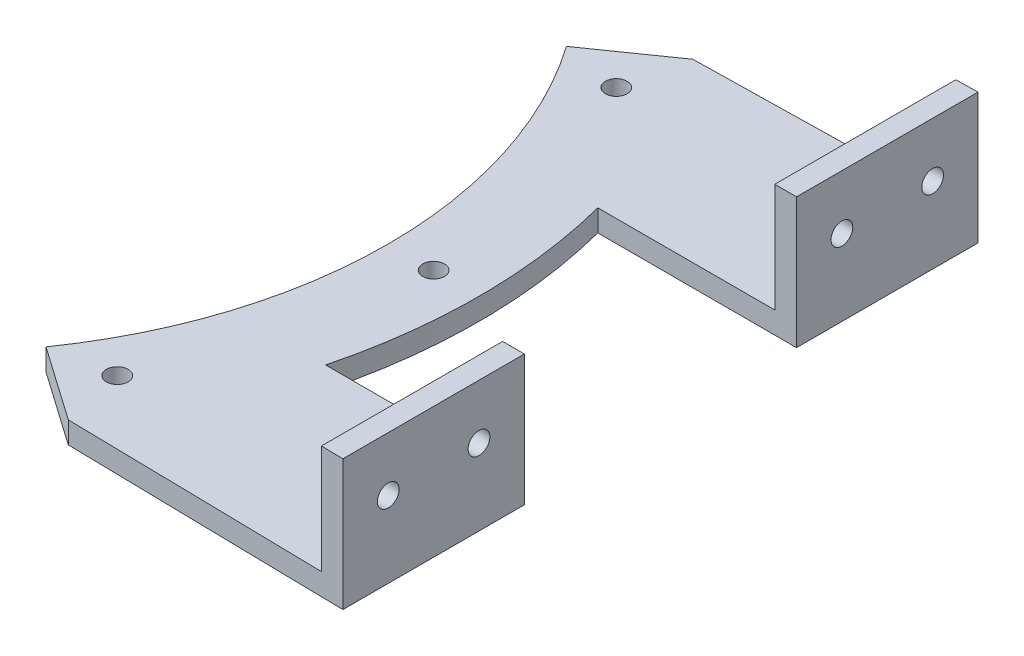
ISO-10303-21;
HEADER;
FILE_DESCRIPTION(('STEP AP214'),'2;1');
FILE_NAME('part.step','',(''),(''),'','','');
FILE_SCHEMA(('AUTOMOTIVE_DESIGN { 1 0 10303 214 1 1 1 1 }'));
ENDSEC;
DATA;
#1=APPLICATION_CONTEXT('core data for automotive mechanical design processes');
#2=APPLICATION_PROTOCOL_DEFINITION('international standard','automotive_design',2000,#1);
#3=PRODUCT_CONTEXT('',#1,'mechanical');
#4=PRODUCT('Part','Part','',(#3));
#5=PRODUCT_RELATED_PRODUCT_CATEGORY('part','',(#4));
#6=PRODUCT_DEFINITION_FORMATION('','',#4);
#7=PRODUCT_DEFINITION_CONTEXT('part definition',#1,'design');
#8=PRODUCT_DEFINITION('design','',#6,#7);
#9=PRODUCT_DEFINITION_SHAPE('','',#8);
#10=(LENGTH_UNIT() NAMED_UNIT(*) SI_UNIT(.MILLI.,.METRE.));
#11=(NAMED_UNIT(*) PLANE_ANGLE_UNIT() SI_UNIT($,.RADIAN.));
#12=(NAMED_UNIT(*) SI_UNIT($,.STERADIAN.) SOLID_ANGLE_UNIT());
#13=UNCERTAINTY_MEASURE_WITH_UNIT(LENGTH_MEASURE(1.E-05),#10,'distance_accuracy_value','');
#14=(GEOMETRIC_REPRESENTATION_CONTEXT(3) GLOBAL_UNCERTAINTY_ASSIGNED_CONTEXT((#13)) GLOBAL_UNIT_ASSIGNED_CONTEXT((#10,
#11,#12)) REPRESENTATION_CONTEXT('',''));
#15=CARTESIAN_POINT('',(0.,0.,0.));
#16=DIRECTION('',(0.,0.,1.));
#17=DIRECTION('',(1.,0.,0.));
#18=AXIS2_PLACEMENT_3D('',#15,#16,#17);
#19=CARTESIAN_POINT('',(0.,12.,0.));
#20=DIRECTION('',(0.,1.,0.));
#21=DIRECTION('',(0.,0.,1.));
#22=AXIS2_PLACEMENT_3D('',#19,#20,#21);
#23=PLANE('',#22);
#24=CARTESIAN_POINT('',(275.,12.,0.));
#25=DIRECTION('',(0.,1.,0.));
#26=DIRECTION('',(0.,0.,1.));
#27=AXIS2_PLACEMENT_3D('',#24,#25,#26);
#28=CIRCLE('',#27,5.99999999999999);
#29=CARTESIAN_POINT('',(275.,12.,5.99999999999999));
#30=VERTEX_POINT('',#29);
#31=EDGE_CURVE('E195',#30,#30,#28,.T.);
#32=ORIENTED_EDGE('',*,*,#31,.F.);
#33=EDGE_LOOP('',(#32));
#34=FACE_BOUND('',#33,.T.);
#35=CARTESIAN_POINT('',(238.15698604072,12.,137.5));
#36=DIRECTION('',(0.,1.,0.));
#37=DIRECTION('',(0.,0.,1.));
#38=AXIS2_PLACEMENT_3D('',#35,#36,#37);
#39=CIRCLE('',#38,5.99999999999999);
#40=CARTESIAN_POINT('',(238.15698604072,12.,143.5));
#41=VERTEX_POINT('',#40);
#42=EDGE_CURVE('E201',#41,#41,#39,.T.);
#43=ORIENTED_EDGE('',*,*,#42,.F.);
#44=EDGE_LOOP('',(#43));
#45=FACE_BOUND('',#44,.T.);
#46=CARTESIAN_POINT('',(238.15698604072,12.,-137.5));
#47=DIRECTION('',(0.,1.,0.));
#48=DIRECTION('',(0.,0.,1.));
#49=AXIS2_PLACEMENT_3D('',#46,#47,#48);
#50=CIRCLE('',#49,5.99999999999999);
#51=CARTESIAN_POINT('',(238.15698604072,12.,-131.5));
#52=VERTEX_POINT('',#51);
#53=EDGE_CURVE('E189',#52,#52,#50,.T.);
#54=ORIENTED_EDGE('',*,*,#53,.F.);
#55=EDGE_LOOP('',(#54));
#56=FACE_BOUND('',#55,.T.);
#57=DIRECTION('',(1.,0.,0.));
#58=VECTOR('',#57,1.);
#59=CARTESIAN_POINT('',(400.,12.,-75.));
#60=LINE('',#59,#58);
#61=CARTESIAN_POINT('',(290.473750965556,12.,-75.));
#62=VERTEX_POINT('',#61);
#63=CARTESIAN_POINT('',(388.002159856452,12.,-75.));
#64=VERTEX_POINT('',#63);
#65=EDGE_CURVE('E50',#62,#64,#60,.T.);
#66=ORIENTED_EDGE('',*,*,#65,.T.);
#67=DIRECTION('',(0.,0.,1.));
#68=VECTOR('',#67,1.);
#69=CARTESIAN_POINT('',(388.002159856452,12.,-75.));
#70=LINE('',#69,#68);
#71=CARTESIAN_POINT('',(388.002159856452,12.,-174.772333819249));
#72=VERTEX_POINT('',#71);
#73=EDGE_CURVE('E156',#72,#64,#70,.T.);
#74=ORIENTED_EDGE('',*,*,#73,.F.);
#75=DIRECTION('',(-0.999820011962369,0.,0.0189721817292861));
#76=VECTOR('',#75,1.);
#77=CARTESIAN_POINT('',(245.745613286698,12.,-172.072930905313));
#78=LINE('',#77,#76);
#79=CARTESIAN_POINT('',(245.745613286698,12.,-172.072930905313));
#80=VERTEX_POINT('',#79);
#81=EDGE_CURVE('E207',#72,#80,#78,.T.);
#82=ORIENTED_EDGE('',*,*,#81,.T.);
#83=DIRECTION('',(-0.819152044288993,0.,0.573576436351044));
#84=VECTOR('',#83,1.);
#85=CARTESIAN_POINT('',(204.788011072248,12.,-143.394109087761));
#86=LINE('',#85,#84);
#87=CARTESIAN_POINT('',(204.788011072248,12.,-143.394109087761));
#88=VERTEX_POINT('',#87);
#89=EDGE_CURVE('E210',#80,#88,#86,.T.);
#90=ORIENTED_EDGE('',*,*,#89,.T.);
#91=CARTESIAN_POINT('',(0.,12.,0.));
#92=DIRECTION('',(0.,-1.,0.));
#93=DIRECTION('',(0.,0.,1.));
#94=AXIS2_PLACEMENT_3D('',#91,#92,#93);
#95=CIRCLE('',#94,250.);
#96=CARTESIAN_POINT('',(204.788011072248,12.,143.394109087761));
#97=VERTEX_POINT('',#96);
#98=EDGE_CURVE('E212',#88,#97,#95,.T.);
#99=ORIENTED_EDGE('',*,*,#98,.T.);
#100=DIRECTION('',(0.819152044288993,0.,0.573576436351044));
#101=VECTOR('',#100,1.);
#102=CARTESIAN_POINT('',(204.788011072248,12.,143.394109087761));
#103=LINE('',#102,#101);
#104=CARTESIAN_POINT('',(245.745613286698,12.,172.072930905313));
#105=VERTEX_POINT('',#104);
#106=EDGE_CURVE('E214',#97,#105,#103,.T.);
#107=ORIENTED_EDGE('',*,*,#106,.T.);
#108=DIRECTION('',(0.999820011962369,0.,0.0189721817292861));
#109=VECTOR('',#108,1.);
#110=CARTESIAN_POINT('',(245.745613286698,12.,172.072930905313));
#111=LINE('',#110,#109);
#112=CARTESIAN_POINT('',(388.002159856452,12.,174.772333819249));
#113=VERTEX_POINT('',#112);
#114=EDGE_CURVE('E216',#105,#113,#111,.T.);
#115=ORIENTED_EDGE('',*,*,#114,.T.);
#116=DIRECTION('',(0.,0.,1.));
#117=VECTOR('',#116,1.);
#118=CARTESIAN_POINT('',(388.002159856452,12.,75.));
#119=LINE('',#118,#117);
#120=CARTESIAN_POINT('',(388.002159856452,12.,75.));
#121=VERTEX_POINT('',#120);
#122=EDGE_CURVE('E57',#121,#113,#119,.T.);
#123=ORIENTED_EDGE('',*,*,#122,.F.);
#124=DIRECTION('',(-1.,0.,0.));
#125=VECTOR('',#124,1.);
#126=CARTESIAN_POINT('',(400.,12.,75.));
#127=LINE('',#126,#125);
#128=CARTESIAN_POINT('',(290.473750965556,12.,75.));
#129=VERTEX_POINT('',#128);
#130=EDGE_CURVE('E218',#121,#129,#127,.T.);
#131=ORIENTED_EDGE('',*,*,#130,.T.);
#132=CARTESIAN_POINT('',(0.,12.,0.));
#133=DIRECTION('',(0.,1.,0.));
#134=DIRECTION('',(0.,0.,1.));
#135=AXIS2_PLACEMENT_3D('',#132,#133,#134);
#136=CIRCLE('',#135,300.);
#137=EDGE_CURVE('E220',#129,#62,#136,.T.);
#138=ORIENTED_EDGE('',*,*,#137,.T.);
#139=EDGE_LOOP('',(#66,#74,#82,#90,#99,#107,#115,#123,#131,#138));
#140=FACE_BOUND('',#139,.T.);
#141=ADVANCED_FACE('F35',(#34,#45,#56,#140),#23,.T.);
#142=CARTESIAN_POINT('',(0.,0.,0.));
#143=DIRECTION('',(0.,1.,0.));
#144=DIRECTION('',(0.,0.,1.));
#145=AXIS2_PLACEMENT_3D('',#142,#143,#144);
#146=PLANE('',#145);
#147=DIRECTION('',(1.,0.,0.));
#148=VECTOR('',#147,1.);
#149=CARTESIAN_POINT('',(400.,0.,-75.));
#150=LINE('',#149,#148);
#151=CARTESIAN_POINT('',(290.473750965556,0.,-75.));
#152=VERTEX_POINT('',#151);
#153=CARTESIAN_POINT('',(400.,0.,-75.));
#154=VERTEX_POINT('',#153);
#155=EDGE_CURVE('E142',#152,#154,#150,.T.);
#156=ORIENTED_EDGE('',*,*,#155,.F.);
#157=CARTESIAN_POINT('',(0.,0.,0.));
#158=DIRECTION('',(0.,1.,0.));
#159=DIRECTION('',(0.,0.,1.));
#160=AXIS2_PLACEMENT_3D('',#157,#158,#159);
#161=CIRCLE('',#160,300.);
#162=CARTESIAN_POINT('',(290.473750965556,0.,75.));
#163=VERTEX_POINT('',#162);
#164=EDGE_CURVE('E208',#163,#152,#161,.T.);
#165=ORIENTED_EDGE('',*,*,#164,.F.);
#166=DIRECTION('',(-1.,0.,0.));
#167=VECTOR('',#166,1.);
#168=CARTESIAN_POINT('',(400.,0.,75.));
#169=LINE('',#168,#167);
#170=CARTESIAN_POINT('',(400.,0.,75.));
#171=VERTEX_POINT('',#170);
#172=EDGE_CURVE('E238',#171,#163,#169,.T.);
#173=ORIENTED_EDGE('',*,*,#172,.F.);
#174=DIRECTION('',(0.,0.,-1.));
#175=VECTOR('',#174,1.);
#176=CARTESIAN_POINT('',(400.,0.,175.));
#177=LINE('',#176,#175);
#178=CARTESIAN_POINT('',(400.,0.,175.));
#179=VERTEX_POINT('',#178);
#180=EDGE_CURVE('E236',#179,#171,#177,.T.);
#181=ORIENTED_EDGE('',*,*,#180,.F.);
#182=DIRECTION('',(0.999820011962369,0.,0.0189721817292861));
#183=VECTOR('',#182,1.);
#184=CARTESIAN_POINT('',(245.745613286698,0.,172.072930905313));
#185=LINE('',#184,#183);
#186=CARTESIAN_POINT('',(245.745613286698,0.,172.072930905313));
#187=VERTEX_POINT('',#186);
#188=EDGE_CURVE('E234',#187,#179,#185,.T.);
#189=ORIENTED_EDGE('',*,*,#188,.F.);
#190=DIRECTION('',(0.819152044288993,0.,0.573576436351044));
#191=VECTOR('',#190,1.);
#192=CARTESIAN_POINT('',(204.788011072248,0.,143.394109087761));
#193=LINE('',#192,#191);
#194=CARTESIAN_POINT('',(204.788011072248,0.,143.394109087761));
#195=VERTEX_POINT('',#194);
#196=EDGE_CURVE('E232',#195,#187,#193,.T.);
#197=ORIENTED_EDGE('',*,*,#196,.F.);
#198=CARTESIAN_POINT('',(0.,0.,0.));
#199=DIRECTION('',(0.,-1.,0.));
#200=DIRECTION('',(0.,0.,1.));
#201=AXIS2_PLACEMENT_3D('',#198,#199,#200);
#202=CIRCLE('',#201,250.);
#203=CARTESIAN_POINT('',(204.788011072248,0.,-143.394109087761));
#204=VERTEX_POINT('',#203);
#205=EDGE_CURVE('E230',#204,#195,#202,.T.);
#206=ORIENTED_EDGE('',*,*,#205,.F.);
#207=DIRECTION('',(-0.819152044288993,0.,0.573576436351044));
#208=VECTOR('',#207,1.);
#209=CARTESIAN_POINT('',(204.788011072248,0.,-143.394109087761));
#210=LINE('',#209,#208);
#211=CARTESIAN_POINT('',(245.745613286698,0.,-172.072930905313));
#212=VERTEX_POINT('',#211);
#213=EDGE_CURVE('E228',#212,#204,#210,.T.);
#214=ORIENTED_EDGE('',*,*,#213,.F.);
#215=DIRECTION('',(-0.999820011962369,0.,0.0189721817292861));
#216=VECTOR('',#215,1.);
#217=CARTESIAN_POINT('',(245.745613286698,0.,-172.072930905313));
#218=LINE('',#217,#216);
#219=CARTESIAN_POINT('',(400.,0.,-175.));
#220=VERTEX_POINT('',#219);
#221=EDGE_CURVE('E226',#220,#212,#218,.T.);
#222=ORIENTED_EDGE('',*,*,#221,.F.);
#223=DIRECTION('',(0.,0.,-1.));
#224=VECTOR('',#223,1.);
#225=CARTESIAN_POINT('',(400.,0.,-175.));
#226=LINE('',#225,#224);
#227=EDGE_CURVE('E224',#154,#220,#226,.T.);
#228=ORIENTED_EDGE('',*,*,#227,.F.);
#229=EDGE_LOOP('',(#156,#165,#173,#181,#189,#197,#206,#214,#222,#228));
#230=FACE_BOUND('',#229,.T.);
#231=CARTESIAN_POINT('',(238.15698604072,0.,137.5));
#232=DIRECTION('',(0.,1.,0.));
#233=DIRECTION('',(0.,0.,1.));
#234=AXIS2_PLACEMENT_3D('',#231,#232,#233);
#235=CIRCLE('',#234,5.99999999999999);
#236=CARTESIAN_POINT('',(238.15698604072,0.,143.5));
#237=VERTEX_POINT('',#236);
#238=EDGE_CURVE('E198',#237,#237,#235,.T.);
#239=ORIENTED_EDGE('',*,*,#238,.T.);
#240=EDGE_LOOP('',(#239));
#241=FACE_BOUND('',#240,.T.);
#242=CARTESIAN_POINT('',(275.,0.,0.));
#243=DIRECTION('',(0.,1.,0.));
#244=DIRECTION('',(0.,0.,1.));
#245=AXIS2_PLACEMENT_3D('',#242,#243,#244);
#246=CIRCLE('',#245,5.99999999999999);
#247=CARTESIAN_POINT('',(275.,0.,5.99999999999999));
#248=VERTEX_POINT('',#247);
#249=EDGE_CURVE('E192',#248,#248,#246,.T.);
#250=ORIENTED_EDGE('',*,*,#249,.T.);
#251=EDGE_LOOP('',(#250));
#252=FACE_BOUND('',#251,.T.);
#253=CARTESIAN_POINT('',(238.15698604072,0.,-137.5));
#254=DIRECTION('',(0.,1.,0.));
#255=DIRECTION('',(0.,0.,1.));
#256=AXIS2_PLACEMENT_3D('',#253,#254,#255);
#257=CIRCLE('',#256,5.99999999999999);
#258=CARTESIAN_POINT('',(238.15698604072,0.,-131.5));
#259=VERTEX_POINT('',#258);
#260=EDGE_CURVE('E188',#259,#259,#257,.T.);
#261=ORIENTED_EDGE('',*,*,#260,.T.);
#262=EDGE_LOOP('',(#261));
#263=FACE_BOUND('',#262,.T.);
#264=ADVANCED_FACE('F269',(#230,#241,#252,#263),#146,.F.);
#265=CARTESIAN_POINT('',(400.,12.,-75.));
#266=DIRECTION('',(0.,0.,-1.));
#267=DIRECTION('',(-1.,0.,0.));
#268=AXIS2_PLACEMENT_3D('',#265,#266,#267);
#269=PLANE('',#268);
#270=ORIENTED_EDGE('',*,*,#155,.T.);
#271=DIRECTION('',(0.,-1.,0.));
#272=VECTOR('',#271,1.);
#273=CARTESIAN_POINT('',(400.,12.,-75.));
#274=LINE('',#273,#272);
#275=CARTESIAN_POINT('',(400.,72.,-75.));
#276=VERTEX_POINT('',#275);
#277=EDGE_CURVE('E11',#276,#154,#274,.T.);
#278=ORIENTED_EDGE('',*,*,#277,.F.);
#279=DIRECTION('',(1.,0.,0.));
#280=VECTOR('',#279,1.);
#281=CARTESIAN_POINT('',(400.,72.,-75.));
#282=LINE('',#281,#280);
#283=CARTESIAN_POINT('',(388.002159856452,72.,-75.));
#284=VERTEX_POINT('',#283);
#285=EDGE_CURVE('E139',#284,#276,#282,.T.);
#286=ORIENTED_EDGE('',*,*,#285,.F.);
#287=DIRECTION('',(0.,-1.,0.));
#288=VECTOR('',#287,1.);
#289=CARTESIAN_POINT('',(388.002159856452,72.,-75.));
#290=LINE('',#289,#288);
#291=EDGE_CURVE('E165',#284,#64,#290,.T.);
#292=ORIENTED_EDGE('',*,*,#291,.T.);
#293=ORIENTED_EDGE('',*,*,#65,.F.);
#294=DIRECTION('',(0.,-1.,0.));
#295=VECTOR('',#294,1.);
#296=CARTESIAN_POINT('',(290.473750965556,12.,-75.));
#297=LINE('',#296,#295);
#298=EDGE_CURVE('E222',#62,#152,#297,.T.);
#299=ORIENTED_EDGE('',*,*,#298,.T.);
#300=EDGE_LOOP('',(#270,#278,#286,#292,#293,#299));
#301=FACE_BOUND('',#300,.T.);
#302=ADVANCED_FACE('F37',(#301),#269,.F.);
#303=CARTESIAN_POINT('',(400.,12.,-175.));
#304=DIRECTION('',(-1.,0.,0.));
#305=DIRECTION('',(0.,0.,1.));
#306=AXIS2_PLACEMENT_3D('',#303,#304,#305);
#307=PLANE('',#306);
#308=CARTESIAN_POINT('',(400.,42.,-150.));
#309=DIRECTION('',(-1.,0.,0.));
#310=DIRECTION('',(0.,0.,1.));
#311=AXIS2_PLACEMENT_3D('',#308,#309,#310);
#312=CIRCLE('',#311,6.00000000000002);
#313=CARTESIAN_POINT('',(400.,42.,-144.));
#314=VERTEX_POINT('',#313);
#315=EDGE_CURVE('E158',#314,#314,#312,.T.);
#316=ORIENTED_EDGE('',*,*,#315,.T.);
#317=EDGE_LOOP('',(#316));
#318=FACE_BOUND('',#317,.T.);
#319=CARTESIAN_POINT('',(400.,42.,-99.9999999999998));
#320=DIRECTION('',(-1.,0.,0.));
#321=DIRECTION('',(0.,0.,1.));
#322=AXIS2_PLACEMENT_3D('',#319,#320,#321);
#323=CIRCLE('',#322,6.);
#324=CARTESIAN_POINT('',(400.,42.,-93.9999999999998));
#325=VERTEX_POINT('',#324);
#326=EDGE_CURVE('E366',#325,#325,#323,.T.);
#327=ORIENTED_EDGE('',*,*,#326,.T.);
#328=EDGE_LOOP('',(#327));
#329=FACE_BOUND('',#328,.T.);
#330=ORIENTED_EDGE('',*,*,#227,.T.);
#331=DIRECTION('',(0.,-1.,0.));
#332=VECTOR('',#331,1.);
#333=CARTESIAN_POINT('',(400.,12.,-175.));
#334=LINE('',#333,#332);
#335=CARTESIAN_POINT('',(400.,72.,-175.));
#336=VERTEX_POINT('',#335);
#337=EDGE_CURVE('E43',#336,#220,#334,.T.);
#338=ORIENTED_EDGE('',*,*,#337,.F.);
#339=DIRECTION('',(0.,0.,-1.));
#340=VECTOR('',#339,1.);
#341=CARTESIAN_POINT('',(400.,72.,-75.));
#342=LINE('',#341,#340);
#343=EDGE_CURVE('E145',#276,#336,#342,.T.);
#344=ORIENTED_EDGE('',*,*,#343,.F.);
#345=ORIENTED_EDGE('',*,*,#277,.T.);
#346=EDGE_LOOP('',(#330,#338,#344,#345));
#347=FACE_BOUND('',#346,.T.);
#348=ADVANCED_FACE('F146',(#318,#329,#347),#307,.F.);
#349=CARTESIAN_POINT('',(245.745613286698,12.,-172.072930905313));
#350=DIRECTION('',(0.0189721817292861,0.,0.999820011962369));
#351=DIRECTION('',(0.999820011962369,0.,-0.0189721817292861));
#352=AXIS2_PLACEMENT_3D('',#349,#350,#351);
#353=PLANE('',#352);
#354=ORIENTED_EDGE('',*,*,#221,.T.);
#355=DIRECTION('',(0.,-1.,0.));
#356=VECTOR('',#355,1.);
#357=CARTESIAN_POINT('',(245.745613286698,12.,-172.072930905313));
#358=LINE('',#357,#356);
#359=EDGE_CURVE('E260',#80,#212,#358,.T.);
#360=ORIENTED_EDGE('',*,*,#359,.F.);
#361=ORIENTED_EDGE('',*,*,#81,.F.);
#362=DIRECTION('',(0.,-1.,0.));
#363=VECTOR('',#362,1.);
#364=CARTESIAN_POINT('',(388.002159856452,72.,-174.772333819249));
#365=LINE('',#364,#363);
#366=CARTESIAN_POINT('',(388.002159856452,72.,-174.772333819249));
#367=VERTEX_POINT('',#366);
#368=EDGE_CURVE('E168',#367,#72,#365,.T.);
#369=ORIENTED_EDGE('',*,*,#368,.F.);
#370=DIRECTION('',(-0.999820011962369,0.,0.0189721817292857));
#371=VECTOR('',#370,1.);
#372=CARTESIAN_POINT('',(400.,72.,-175.));
#373=LINE('',#372,#371);
#374=EDGE_CURVE('E150',#336,#367,#373,.T.);
#375=ORIENTED_EDGE('',*,*,#374,.F.);
#376=ORIENTED_EDGE('',*,*,#337,.T.);
#377=EDGE_LOOP('',(#354,#360,#361,#369,#375,#376));
#378=FACE_BOUND('',#377,.T.);
#379=ADVANCED_FACE('F264',(#378),#353,.F.);
#380=CARTESIAN_POINT('',(204.788011072248,12.,-143.394109087761));
#381=DIRECTION('',(0.573576436351044,0.,0.819152044288993));
#382=DIRECTION('',(0.819152044288993,0.,-0.573576436351044));
#383=AXIS2_PLACEMENT_3D('',#380,#381,#382);
#384=PLANE('',#383);
#385=ORIENTED_EDGE('',*,*,#213,.T.);
#386=DIRECTION('',(0.,-1.,0.));
#387=VECTOR('',#386,1.);
#388=CARTESIAN_POINT('',(204.788011072248,12.,-143.394109087761));
#389=LINE('',#388,#387);
#390=EDGE_CURVE('E257',#88,#204,#389,.T.);
#391=ORIENTED_EDGE('',*,*,#390,.F.);
#392=ORIENTED_EDGE('',*,*,#89,.F.);
#393=ORIENTED_EDGE('',*,*,#359,.T.);
#394=EDGE_LOOP('',(#385,#391,#392,#393));
#395=FACE_BOUND('',#394,.T.);
#396=ADVANCED_FACE('F275',(#395),#384,.F.);
#397=CARTESIAN_POINT('',(0.,12.,0.));
#398=DIRECTION('',(0.,-1.,0.));
#399=DIRECTION('',(0.,0.,-1.));
#400=AXIS2_PLACEMENT_3D('',#397,#398,#399);
#401=CYLINDRICAL_SURFACE('',#400,250.);
#402=ORIENTED_EDGE('',*,*,#205,.T.);
#403=DIRECTION('',(0.,-1.,0.));
#404=VECTOR('',#403,1.);
#405=CARTESIAN_POINT('',(204.788011072248,12.,143.394109087761));
#406=LINE('',#405,#404);
#407=EDGE_CURVE('E254',#97,#195,#406,.T.);
#408=ORIENTED_EDGE('',*,*,#407,.F.);
#409=ORIENTED_EDGE('',*,*,#98,.F.);
#410=ORIENTED_EDGE('',*,*,#390,.T.);
#411=EDGE_LOOP('',(#402,#408,#409,#410));
#412=FACE_BOUND('',#411,.T.);
#413=ADVANCED_FACE('F279',(#412),#401,.F.);
#414=CARTESIAN_POINT('',(204.788011072248,12.,143.394109087761));
#415=DIRECTION('',(0.573576436351044,0.,-0.819152044288993));
#416=DIRECTION('',(-0.819152044288993,0.,-0.573576436351044));
#417=AXIS2_PLACEMENT_3D('',#414,#415,#416);
#418=PLANE('',#417);
#419=ORIENTED_EDGE('',*,*,#196,.T.);
#420=DIRECTION('',(0.,-1.,0.));
#421=VECTOR('',#420,1.);
#422=CARTESIAN_POINT('',(245.745613286698,12.,172.072930905313));
#423=LINE('',#422,#421);
#424=EDGE_CURVE('E251',#105,#187,#423,.T.);
#425=ORIENTED_EDGE('',*,*,#424,.F.);
#426=ORIENTED_EDGE('',*,*,#106,.F.);
#427=ORIENTED_EDGE('',*,*,#407,.T.);
#428=EDGE_LOOP('',(#419,#425,#426,#427));
#429=FACE_BOUND('',#428,.T.);
#430=ADVANCED_FACE('F310',(#429),#418,.F.);
#431=CARTESIAN_POINT('',(245.745613286698,12.,172.072930905313));
#432=DIRECTION('',(0.0189721817292861,0.,-0.999820011962369));
#433=DIRECTION('',(-0.999820011962369,0.,-0.0189721817292861));
#434=AXIS2_PLACEMENT_3D('',#431,#432,#433);
#435=PLANE('',#434);
#436=ORIENTED_EDGE('',*,*,#188,.T.);
#437=DIRECTION('',(0.,-1.,0.));
#438=VECTOR('',#437,1.);
#439=CARTESIAN_POINT('',(400.,12.,175.));
#440=LINE('',#439,#438);
#441=CARTESIAN_POINT('',(400.,72.,175.));
#442=VERTEX_POINT('',#441);
#443=EDGE_CURVE('E248',#442,#179,#440,.T.);
#444=ORIENTED_EDGE('',*,*,#443,.F.);
#445=DIRECTION('',(0.999820011962368,0.,0.0189721817292881));
#446=VECTOR('',#445,1.);
#447=CARTESIAN_POINT('',(388.002159856452,72.,174.772333819249));
#448=LINE('',#447,#446);
#449=CARTESIAN_POINT('',(388.002159856452,72.,174.772333819249));
#450=VERTEX_POINT('',#449);
#451=EDGE_CURVE('E171',#450,#442,#448,.T.);
#452=ORIENTED_EDGE('',*,*,#451,.F.);
#453=DIRECTION('',(0.,-1.,0.));
#454=VECTOR('',#453,1.);
#455=CARTESIAN_POINT('',(388.002159856452,72.,174.772333819249));
#456=LINE('',#455,#454);
#457=EDGE_CURVE('E181',#450,#113,#456,.T.);
#458=ORIENTED_EDGE('',*,*,#457,.T.);
#459=ORIENTED_EDGE('',*,*,#114,.F.);
#460=ORIENTED_EDGE('',*,*,#424,.T.);
#461=EDGE_LOOP('',(#436,#444,#452,#458,#459,#460));
#462=FACE_BOUND('',#461,.T.);
#463=ADVANCED_FACE('F306',(#462),#435,.F.);
#464=CARTESIAN_POINT('',(400.,12.,175.));
#465=DIRECTION('',(-1.,0.,0.));
#466=DIRECTION('',(0.,0.,1.));
#467=AXIS2_PLACEMENT_3D('',#464,#465,#466);
#468=PLANE('',#467);
#469=CARTESIAN_POINT('',(400.,42.,100.));
#470=DIRECTION('',(-1.,0.,0.));
#471=DIRECTION('',(0.,0.,1.));
#472=AXIS2_PLACEMENT_3D('',#469,#470,#471);
#473=CIRCLE('',#472,6.);
#474=CARTESIAN_POINT('',(400.,42.,106.));
#475=VERTEX_POINT('',#474);
#476=EDGE_CURVE('E374',#475,#475,#473,.T.);
#477=ORIENTED_EDGE('',*,*,#476,.T.);
#478=EDGE_LOOP('',(#477));
#479=FACE_BOUND('',#478,.T.);
#480=CARTESIAN_POINT('',(400.,42.,150.));
#481=DIRECTION('',(-1.,0.,0.));
#482=DIRECTION('',(0.,0.,1.));
#483=AXIS2_PLACEMENT_3D('',#480,#481,#482);
#484=CIRCLE('',#483,6.00000000000002);
#485=CARTESIAN_POINT('',(400.,42.,156.));
#486=VERTEX_POINT('',#485);
#487=EDGE_CURVE('E382',#486,#486,#484,.T.);
#488=ORIENTED_EDGE('',*,*,#487,.T.);
#489=EDGE_LOOP('',(#488));
#490=FACE_BOUND('',#489,.T.);
#491=ORIENTED_EDGE('',*,*,#180,.T.);
#492=DIRECTION('',(0.,-1.,0.));
#493=VECTOR('',#492,1.);
#494=CARTESIAN_POINT('',(400.,12.,75.));
#495=LINE('',#494,#493);
#496=CARTESIAN_POINT('',(400.,72.,75.));
#497=VERTEX_POINT('',#496);
#498=EDGE_CURVE('E245',#497,#171,#495,.T.);
#499=ORIENTED_EDGE('',*,*,#498,.F.);
#500=DIRECTION('',(0.,0.,-1.));
#501=VECTOR('',#500,1.);
#502=CARTESIAN_POINT('',(400.,72.,175.));
#503=LINE('',#502,#501);
#504=EDGE_CURVE('E174',#442,#497,#503,.T.);
#505=ORIENTED_EDGE('',*,*,#504,.F.);
#506=ORIENTED_EDGE('',*,*,#443,.T.);
#507=EDGE_LOOP('',(#491,#499,#505,#506));
#508=FACE_BOUND('',#507,.T.);
#509=ADVANCED_FACE('F299',(#479,#490,#508),#468,.F.);
#510=CARTESIAN_POINT('',(400.,12.,75.));
#511=DIRECTION('',(0.,0.,1.));
#512=DIRECTION('',(1.,0.,0.));
#513=AXIS2_PLACEMENT_3D('',#510,#511,#512);
#514=PLANE('',#513);
#515=ORIENTED_EDGE('',*,*,#172,.T.);
#516=DIRECTION('',(0.,-1.,0.));
#517=VECTOR('',#516,1.);
#518=CARTESIAN_POINT('',(290.473750965556,12.,75.));
#519=LINE('',#518,#517);
#520=EDGE_CURVE('E242',#129,#163,#519,.T.);
#521=ORIENTED_EDGE('',*,*,#520,.F.);
#522=ORIENTED_EDGE('',*,*,#130,.F.);
#523=DIRECTION('',(0.,-1.,0.));
#524=VECTOR('',#523,1.);
#525=CARTESIAN_POINT('',(388.002159856452,72.,75.));
#526=LINE('',#525,#524);
#527=CARTESIAN_POINT('',(388.002159856452,72.,75.));
#528=VERTEX_POINT('',#527);
#529=EDGE_CURVE('E185',#528,#121,#526,.T.);
#530=ORIENTED_EDGE('',*,*,#529,.F.);
#531=DIRECTION('',(-1.,0.,0.));
#532=VECTOR('',#531,1.);
#533=CARTESIAN_POINT('',(400.,72.,75.));
#534=LINE('',#533,#532);
#535=EDGE_CURVE('E177',#497,#528,#534,.T.);
#536=ORIENTED_EDGE('',*,*,#535,.F.);
#537=ORIENTED_EDGE('',*,*,#498,.T.);
#538=EDGE_LOOP('',(#515,#521,#522,#530,#536,#537));
#539=FACE_BOUND('',#538,.T.);
#540=ADVANCED_FACE('F294',(#539),#514,.F.);
#541=CARTESIAN_POINT('',(0.,12.,0.));
#542=DIRECTION('',(0.,-1.,0.));
#543=DIRECTION('',(0.,0.,-1.));
#544=AXIS2_PLACEMENT_3D('',#541,#542,#543);
#545=CYLINDRICAL_SURFACE('',#544,300.);
#546=ORIENTED_EDGE('',*,*,#164,.T.);
#547=ORIENTED_EDGE('',*,*,#298,.F.);
#548=ORIENTED_EDGE('',*,*,#137,.F.);
#549=ORIENTED_EDGE('',*,*,#520,.T.);
#550=EDGE_LOOP('',(#546,#547,#548,#549));
#551=FACE_BOUND('',#550,.T.);
#552=ADVANCED_FACE('F291',(#551),#545,.T.);
#553=CARTESIAN_POINT('',(238.15698604072,12.,137.5));
#554=DIRECTION('',(0.,-1.,0.));
#555=DIRECTION('',(0.,0.,-1.));
#556=AXIS2_PLACEMENT_3D('',#553,#554,#555);
#557=CYLINDRICAL_SURFACE('',#556,5.99999999999999);
#558=ORIENTED_EDGE('',*,*,#42,.T.);
#559=EDGE_LOOP('',(#558));
#560=FACE_BOUND('',#559,.T.);
#561=ORIENTED_EDGE('',*,*,#238,.F.);
#562=EDGE_LOOP('',(#561));
#563=FACE_BOUND('',#562,.T.);
#564=ADVANCED_FACE('F337',(#560,#563),#557,.F.);
#565=CARTESIAN_POINT('',(275.,12.,0.));
#566=DIRECTION('',(0.,-1.,0.));
#567=DIRECTION('',(0.,0.,-1.));
#568=AXIS2_PLACEMENT_3D('',#565,#566,#567);
#569=CYLINDRICAL_SURFACE('',#568,5.99999999999999);
#570=ORIENTED_EDGE('',*,*,#31,.T.);
#571=EDGE_LOOP('',(#570));
#572=FACE_BOUND('',#571,.T.);
#573=ORIENTED_EDGE('',*,*,#249,.F.);
#574=EDGE_LOOP('',(#573));
#575=FACE_BOUND('',#574,.T.);
#576=ADVANCED_FACE('F322',(#572,#575),#569,.F.);
#577=CARTESIAN_POINT('',(238.15698604072,12.,-137.5));
#578=DIRECTION('',(0.,-1.,0.));
#579=DIRECTION('',(0.,0.,-1.));
#580=AXIS2_PLACEMENT_3D('',#577,#578,#579);
#581=CYLINDRICAL_SURFACE('',#580,5.99999999999999);
#582=ORIENTED_EDGE('',*,*,#53,.T.);
#583=EDGE_LOOP('',(#582));
#584=FACE_BOUND('',#583,.T.);
#585=ORIENTED_EDGE('',*,*,#260,.F.);
#586=EDGE_LOOP('',(#585));
#587=FACE_BOUND('',#586,.T.);
#588=ADVANCED_FACE('F314',(#584,#587),#581,.F.);
#589=CARTESIAN_POINT('',(388.002159856452,72.,75.));
#590=DIRECTION('',(1.,0.,0.));
#591=DIRECTION('',(0.,0.,-1.));
#592=AXIS2_PLACEMENT_3D('',#589,#590,#591);
#593=PLANE('',#592);
#594=CARTESIAN_POINT('',(388.002159856452,42.,100.));
#595=DIRECTION('',(-1.,0.,0.));
#596=DIRECTION('',(0.,0.,1.));
#597=AXIS2_PLACEMENT_3D('',#594,#595,#596);
#598=CIRCLE('',#597,6.);
#599=CARTESIAN_POINT('',(388.002159856452,42.,106.));
#600=VERTEX_POINT('',#599);
#601=EDGE_CURVE('E380',#600,#600,#598,.T.);
#602=ORIENTED_EDGE('',*,*,#601,.F.);
#603=EDGE_LOOP('',(#602));
#604=FACE_BOUND('',#603,.T.);
#605=CARTESIAN_POINT('',(388.002159856452,42.,150.));
#606=DIRECTION('',(-1.,0.,0.));
#607=DIRECTION('',(0.,0.,1.));
#608=AXIS2_PLACEMENT_3D('',#605,#606,#607);
#609=CIRCLE('',#608,6.00000000000002);
#610=CARTESIAN_POINT('',(388.002159856452,42.,156.));
#611=VERTEX_POINT('',#610);
#612=EDGE_CURVE('E161',#611,#611,#609,.T.);
#613=ORIENTED_EDGE('',*,*,#612,.F.);
#614=EDGE_LOOP('',(#613));
#615=FACE_BOUND('',#614,.T.);
#616=ORIENTED_EDGE('',*,*,#122,.T.);
#617=ORIENTED_EDGE('',*,*,#457,.F.);
#618=DIRECTION('',(0.,0.,1.));
#619=VECTOR('',#618,1.);
#620=CARTESIAN_POINT('',(388.002159856452,72.,75.));
#621=LINE('',#620,#619);
#622=EDGE_CURVE('E179',#528,#450,#621,.T.);
#623=ORIENTED_EDGE('',*,*,#622,.F.);
#624=ORIENTED_EDGE('',*,*,#529,.T.);
#625=EDGE_LOOP('',(#616,#617,#623,#624));
#626=FACE_BOUND('',#625,.T.);
#627=ADVANCED_FACE('F312',(#604,#615,#626),#593,.F.);
#628=CARTESIAN_POINT('',(0.,72.,0.));
#629=DIRECTION('',(0.,1.,0.));
#630=DIRECTION('',(0.,0.,1.));
#631=AXIS2_PLACEMENT_3D('',#628,#629,#630);
#632=PLANE('',#631);
#633=ORIENTED_EDGE('',*,*,#451,.T.);
#634=ORIENTED_EDGE('',*,*,#504,.T.);
#635=ORIENTED_EDGE('',*,*,#535,.T.);
#636=ORIENTED_EDGE('',*,*,#622,.T.);
#637=EDGE_LOOP('',(#633,#634,#635,#636));
#638=FACE_BOUND('',#637,.T.);
#639=ADVANCED_FACE('F301',(#638),#632,.T.);
#640=CARTESIAN_POINT('',(388.002159856452,72.,-75.));
#641=DIRECTION('',(1.,0.,0.));
#642=DIRECTION('',(0.,0.,-1.));
#643=AXIS2_PLACEMENT_3D('',#640,#641,#642);
#644=PLANE('',#643);
#645=CARTESIAN_POINT('',(388.002159856452,42.,-150.));
#646=DIRECTION('',(-1.,0.,0.));
#647=DIRECTION('',(0.,0.,1.));
#648=AXIS2_PLACEMENT_3D('',#645,#646,#647);
#649=CIRCLE('',#648,6.00000000000002);
#650=CARTESIAN_POINT('',(388.002159856452,42.,-144.));
#651=VERTEX_POINT('',#650);
#652=EDGE_CURVE('E368',#651,#651,#649,.T.);
#653=ORIENTED_EDGE('',*,*,#652,.F.);
#654=EDGE_LOOP('',(#653));
#655=FACE_BOUND('',#654,.T.);
#656=CARTESIAN_POINT('',(388.002159856452,42.,-99.9999999999998));
#657=DIRECTION('',(-1.,0.,0.));
#658=DIRECTION('',(0.,0.,1.));
#659=AXIS2_PLACEMENT_3D('',#656,#657,#658);
#660=CIRCLE('',#659,6.);
#661=CARTESIAN_POINT('',(388.002159856452,42.,-93.9999999999998));
#662=VERTEX_POINT('',#661);
#663=EDGE_CURVE('E369',#662,#662,#660,.T.);
#664=ORIENTED_EDGE('',*,*,#663,.F.);
#665=EDGE_LOOP('',(#664));
#666=FACE_BOUND('',#665,.T.);
#667=ORIENTED_EDGE('',*,*,#73,.T.);
#668=ORIENTED_EDGE('',*,*,#291,.F.);
#669=DIRECTION('',(0.,0.,1.));
#670=VECTOR('',#669,1.);
#671=CARTESIAN_POINT('',(388.002159856452,72.,-75.));
#672=LINE('',#671,#670);
#673=EDGE_CURVE('E154',#367,#284,#672,.T.);
#674=ORIENTED_EDGE('',*,*,#673,.F.);
#675=ORIENTED_EDGE('',*,*,#368,.T.);
#676=EDGE_LOOP('',(#667,#668,#674,#675));
#677=FACE_BOUND('',#676,.T.);
#678=ADVANCED_FACE('F284',(#655,#666,#677),#644,.F.);
#679=CARTESIAN_POINT('',(0.,72.,0.));
#680=DIRECTION('',(0.,-1.,0.));
#681=DIRECTION('',(0.,0.,-1.));
#682=AXIS2_PLACEMENT_3D('',#679,#680,#681);
#683=PLANE('',#682);
#684=ORIENTED_EDGE('',*,*,#285,.T.);
#685=ORIENTED_EDGE('',*,*,#343,.T.);
#686=ORIENTED_EDGE('',*,*,#374,.T.);
#687=ORIENTED_EDGE('',*,*,#673,.T.);
#688=EDGE_LOOP('',(#684,#685,#686,#687));
#689=FACE_BOUND('',#688,.T.);
#690=ADVANCED_FACE('F152',(#689),#683,.F.);
#691=CARTESIAN_POINT('',(400.,42.,-99.9999999999998));
#692=DIRECTION('',(-1.,0.,0.));
#693=DIRECTION('',(0.,0.,1.));
#694=AXIS2_PLACEMENT_3D('',#691,#692,#693);
#695=CYLINDRICAL_SURFACE('',#694,6.);
#696=CARTESIAN_POINT('',(400.,42.,-93.9999999999998));
#697=CARTESIAN_POINT('',(399.875022498505,42.,-93.9999999999998));
#698=CARTESIAN_POINT('',(399.75004499701,42.,-93.9999999999998));
#699=CARTESIAN_POINT('',(399.500089994019,42.,-93.9999999999998));
#700=CARTESIAN_POINT('',(399.375112492524,42.,-93.9999999999998));
#701=CARTESIAN_POINT('',(399.125157489533,42.,-93.9999999999998));
#702=CARTESIAN_POINT('',(399.000179988038,42.,-93.9999999999998));
#703=CARTESIAN_POINT('',(398.750224985047,42.,-93.9999999999998));
#704=CARTESIAN_POINT('',(398.625247483552,42.,-93.9999999999998));
#705=CARTESIAN_POINT('',(398.375292480561,42.,-93.9999999999998));
#706=CARTESIAN_POINT('',(398.250314979066,42.,-93.9999999999998));
#707=CARTESIAN_POINT('',(398.000359976075,42.,-93.9999999999998));
#708=CARTESIAN_POINT('',(397.87538247458,42.,-93.9999999999998));
#709=CARTESIAN_POINT('',(397.625427471589,42.,-93.9999999999998));
#710=CARTESIAN_POINT('',(397.500449970094,42.,-93.9999999999998));
#711=CARTESIAN_POINT('',(397.250494967104,42.,-93.9999999999998));
#712=CARTESIAN_POINT('',(397.125517465608,42.,-93.9999999999998));
#713=CARTESIAN_POINT('',(396.875562462618,42.,-93.9999999999998));
#714=CARTESIAN_POINT('',(396.750584961122,42.,-93.9999999999998));
#715=CARTESIAN_POINT('',(396.500629958132,42.,-93.9999999999998));
#716=CARTESIAN_POINT('',(396.375652456636,42.,-93.9999999999998));
#717=CARTESIAN_POINT('',(396.125697453646,42.,-93.9999999999998));
#718=CARTESIAN_POINT('',(396.000719952151,42.,-93.9999999999998));
#719=CARTESIAN_POINT('',(395.75076494916,42.,-93.9999999999998));
#720=CARTESIAN_POINT('',(395.625787447665,42.,-93.9999999999998));
#721=CARTESIAN_POINT('',(395.375832444674,42.,-93.9999999999998));
#722=CARTESIAN_POINT('',(395.250854943179,42.,-93.9999999999998));
#723=CARTESIAN_POINT('',(395.000899940188,42.,-93.9999999999998));
#724=CARTESIAN_POINT('',(394.875922438693,42.,-93.9999999999998));
#725=CARTESIAN_POINT('',(394.625967435702,42.,-93.9999999999998));
#726=CARTESIAN_POINT('',(394.500989934207,42.,-93.9999999999998));
#727=CARTESIAN_POINT('',(394.251034931216,42.,-93.9999999999998));
#728=CARTESIAN_POINT('',(394.126057429721,42.,-93.9999999999998));
#729=CARTESIAN_POINT('',(393.87610242673,42.,-93.9999999999998));
#730=CARTESIAN_POINT('',(393.751124925235,42.,-93.9999999999998));
#731=CARTESIAN_POINT('',(393.501169922245,42.,-93.9999999999998));
#732=CARTESIAN_POINT('',(393.376192420749,42.,-93.9999999999998));
#733=CARTESIAN_POINT('',(393.126237417759,42.,-93.9999999999998));
#734=CARTESIAN_POINT('',(393.001259916263,42.,-93.9999999999998));
#735=CARTESIAN_POINT('',(392.751304913273,42.,-93.9999999999998));
#736=CARTESIAN_POINT('',(392.626327411778,42.,-93.9999999999998));
#737=CARTESIAN_POINT('',(392.376372408787,42.,-93.9999999999998));
#738=CARTESIAN_POINT('',(392.251394907292,42.,-93.9999999999998));
#739=CARTESIAN_POINT('',(392.001439904301,42.,-93.9999999999998));
#740=CARTESIAN_POINT('',(391.876462402806,42.,-93.9999999999998));
#741=CARTESIAN_POINT('',(391.626507399815,42.,-93.9999999999998));
#742=CARTESIAN_POINT('',(391.50152989832,42.,-93.9999999999998));
#743=CARTESIAN_POINT('',(391.251574895329,42.,-93.9999999999998));
#744=CARTESIAN_POINT('',(391.126597393834,42.,-93.9999999999998));
#745=CARTESIAN_POINT('',(390.876642390843,42.,-93.9999999999998));
#746=CARTESIAN_POINT('',(390.751664889348,42.,-93.9999999999998));
#747=CARTESIAN_POINT('',(390.501709886357,42.,-93.9999999999998));
#748=CARTESIAN_POINT('',(390.376732384862,42.,-93.9999999999998));
#749=CARTESIAN_POINT('',(390.126777381872,42.,-93.9999999999998));
#750=CARTESIAN_POINT('',(390.001799880376,42.,-93.9999999999998));
#751=CARTESIAN_POINT('',(389.751844877386,42.,-93.9999999999998));
#752=CARTESIAN_POINT('',(389.62686737589,42.,-93.9999999999998));
#753=CARTESIAN_POINT('',(389.3769123729,42.,-93.9999999999998));
#754=CARTESIAN_POINT('',(389.251934871405,42.,-93.9999999999998));
#755=CARTESIAN_POINT('',(389.001979868414,42.,-93.9999999999998));
#756=CARTESIAN_POINT('',(388.877002366919,42.,-93.9999999999998));
#757=CARTESIAN_POINT('',(388.627047363928,42.,-93.9999999999998));
#758=CARTESIAN_POINT('',(388.502069862433,42.,-93.9999999999998));
#759=CARTESIAN_POINT('',(388.252114859442,42.,-93.9999999999998));
#760=CARTESIAN_POINT('',(388.127137357947,42.,-93.9999999999998));
#761=CARTESIAN_POINT('',(388.002159856452,42.,-93.9999999999998));
#762=B_SPLINE_CURVE_WITH_KNOTS('',3,(#696,#697,#698,#699,#700,#701,#702,#703,#704,#705,#706,
#707,#708,#709,#710,#711,#712,#713,#714,#715,#716,#717,#718,#719,#720,#721,#722,#723,#724,#725,
#726,#727,#728,#729,#730,#731,#732,#733,#734,#735,#736,#737,#738,#739,#740,#741,#742,#743,#744,
#745,#746,#747,#748,#749,#750,#751,#752,#753,#754,#755,#756,#757,#758,#759,#760,#761),
.UNSPECIFIED.,.F.,.F.,(4,2,2,2,2,2,2,2,2,2,2,2,2,2,2,2,2,2,2,2,2,2,2,2,2,2,2,2,2,2,2,2,4),(0.,
0.374932504485948,0.749865008971839,1.12479751345773,1.49973001794362,1.87466252242952,
2.24959502691541,2.6245275314013,2.99946003588719,3.37439254037308,3.74932504485898,
4.12425754934487,4.49919005383076,4.87412255831665,5.24905506280254,5.62398756728844,
5.99892007177433,6.37385257626022,6.74878508074611,7.123717585232,7.49865008971789,
7.87358259420379,8.24851509868962,8.62344760317557,8.99838010766146,9.37331261214736,
9.74824511663325,10.1231776211191,10.498110125605,10.8730426300909,11.2479751345768,
11.6229076390627,11.9978401435486),.UNSPECIFIED.);
#763=EDGE_CURVE('BSEAM401',#325,#662,#762,.T.);
#764=ORIENTED_EDGE('',*,*,#326,.F.);
#765=ORIENTED_EDGE('',*,*,#663,.T.);
#766=ORIENTED_EDGE('',*,*,#763,.T.);
#767=ORIENTED_EDGE('',*,*,#763,.F.);
#768=EDGE_LOOP('',(#764,#766,#765,#767));
#769=FACE_BOUND('',#768,.T.);
#770=ADVANCED_FACE('F401',(#769),#695,.F.);
#771=CARTESIAN_POINT('',(400.,42.,-150.));
#772=DIRECTION('',(-1.,0.,0.));
#773=DIRECTION('',(0.,0.,1.));
#774=AXIS2_PLACEMENT_3D('',#771,#772,#773);
#775=CYLINDRICAL_SURFACE('',#774,6.00000000000002);
#776=CARTESIAN_POINT('',(400.,42.,-144.));
#777=CARTESIAN_POINT('',(399.875022498505,42.,-144.));
#778=CARTESIAN_POINT('',(399.75004499701,42.,-144.));
#779=CARTESIAN_POINT('',(399.500089994019,42.,-144.));
#780=CARTESIAN_POINT('',(399.375112492524,42.,-144.));
#781=CARTESIAN_POINT('',(399.125157489533,42.,-144.));
#782=CARTESIAN_POINT('',(399.000179988038,42.,-144.));
#783=CARTESIAN_POINT('',(398.750224985047,42.,-144.));
#784=CARTESIAN_POINT('',(398.625247483552,42.,-144.));
#785=CARTESIAN_POINT('',(398.375292480561,42.,-144.));
#786=CARTESIAN_POINT('',(398.250314979066,42.,-144.));
#787=CARTESIAN_POINT('',(398.000359976075,42.,-144.));
#788=CARTESIAN_POINT('',(397.87538247458,42.,-144.));
#789=CARTESIAN_POINT('',(397.625427471589,42.,-144.));
#790=CARTESIAN_POINT('',(397.500449970094,42.,-144.));
#791=CARTESIAN_POINT('',(397.250494967104,42.,-144.));
#792=CARTESIAN_POINT('',(397.125517465608,42.,-144.));
#793=CARTESIAN_POINT('',(396.875562462618,42.,-144.));
#794=CARTESIAN_POINT('',(396.750584961122,42.,-144.));
#795=CARTESIAN_POINT('',(396.500629958132,42.,-144.));
#796=CARTESIAN_POINT('',(396.375652456636,42.,-144.));
#797=CARTESIAN_POINT('',(396.125697453646,42.,-144.));
#798=CARTESIAN_POINT('',(396.000719952151,42.,-144.));
#799=CARTESIAN_POINT('',(395.75076494916,42.,-144.));
#800=CARTESIAN_POINT('',(395.625787447665,42.,-144.));
#801=CARTESIAN_POINT('',(395.375832444674,42.,-144.));
#802=CARTESIAN_POINT('',(395.250854943179,42.,-144.));
#803=CARTESIAN_POINT('',(395.000899940188,42.,-144.));
#804=CARTESIAN_POINT('',(394.875922438693,42.,-144.));
#805=CARTESIAN_POINT('',(394.625967435702,42.,-144.));
#806=CARTESIAN_POINT('',(394.500989934207,42.,-144.));
#807=CARTESIAN_POINT('',(394.251034931216,42.,-144.));
#808=CARTESIAN_POINT('',(394.126057429721,42.,-144.));
#809=CARTESIAN_POINT('',(393.87610242673,42.,-144.));
#810=CARTESIAN_POINT('',(393.751124925235,42.,-144.));
#811=CARTESIAN_POINT('',(393.501169922245,42.,-144.));
#812=CARTESIAN_POINT('',(393.376192420749,42.,-144.));
#813=CARTESIAN_POINT('',(393.126237417759,42.,-144.));
#814=CARTESIAN_POINT('',(393.001259916263,42.,-144.));
#815=CARTESIAN_POINT('',(392.751304913273,42.,-144.));
#816=CARTESIAN_POINT('',(392.626327411778,42.,-144.));
#817=CARTESIAN_POINT('',(392.376372408787,42.,-144.));
#818=CARTESIAN_POINT('',(392.251394907292,42.,-144.));
#819=CARTESIAN_POINT('',(392.001439904301,42.,-144.));
#820=CARTESIAN_POINT('',(391.876462402806,42.,-144.));
#821=CARTESIAN_POINT('',(391.626507399815,42.,-144.));
#822=CARTESIAN_POINT('',(391.50152989832,42.,-144.));
#823=CARTESIAN_POINT('',(391.251574895329,42.,-144.));
#824=CARTESIAN_POINT('',(391.126597393834,42.,-144.));
#825=CARTESIAN_POINT('',(390.876642390843,42.,-144.));
#826=CARTESIAN_POINT('',(390.751664889348,42.,-144.));
#827=CARTESIAN_POINT('',(390.501709886357,42.,-144.));
#828=CARTESIAN_POINT('',(390.376732384862,42.,-144.));
#829=CARTESIAN_POINT('',(390.126777381872,42.,-144.));
#830=CARTESIAN_POINT('',(390.001799880376,42.,-144.));
#831=CARTESIAN_POINT('',(389.751844877386,42.,-144.));
#832=CARTESIAN_POINT('',(389.62686737589,42.,-144.));
#833=CARTESIAN_POINT('',(389.3769123729,42.,-144.));
#834=CARTESIAN_POINT('',(389.251934871405,42.,-144.));
#835=CARTESIAN_POINT('',(389.001979868414,42.,-144.));
#836=CARTESIAN_POINT('',(388.877002366919,42.,-144.));
#837=CARTESIAN_POINT('',(388.627047363928,42.,-144.));
#838=CARTESIAN_POINT('',(388.502069862433,42.,-144.));
#839=CARTESIAN_POINT('',(388.252114859442,42.,-144.));
#840=CARTESIAN_POINT('',(388.127137357947,42.,-144.));
#841=CARTESIAN_POINT('',(388.002159856452,42.,-144.));
#842=B_SPLINE_CURVE_WITH_KNOTS('',3,(#776,#777,#778,#779,#780,#781,#782,#783,#784,#785,#786,
#787,#788,#789,#790,#791,#792,#793,#794,#795,#796,#797,#798,#799,#800,#801,#802,#803,#804,#805,
#806,#807,#808,#809,#810,#811,#812,#813,#814,#815,#816,#817,#818,#819,#820,#821,#822,#823,#824,
#825,#826,#827,#828,#829,#830,#831,#832,#833,#834,#835,#836,#837,#838,#839,#840,#841),
.UNSPECIFIED.,.F.,.F.,(4,2,2,2,2,2,2,2,2,2,2,2,2,2,2,2,2,2,2,2,2,2,2,2,2,2,2,2,2,2,2,2,4),(0.,
0.374932504485948,0.749865008971839,1.12479751345773,1.49973001794362,1.87466252242952,
2.24959502691541,2.6245275314013,2.99946003588719,3.37439254037308,3.74932504485898,
4.12425754934487,4.49919005383076,4.87412255831665,5.24905506280254,5.62398756728844,
5.99892007177433,6.37385257626022,6.74878508074611,7.123717585232,7.49865008971789,
7.87358259420379,8.24851509868962,8.62344760317557,8.99838010766146,9.37331261214736,
9.74824511663325,10.1231776211191,10.498110125605,10.8730426300909,11.2479751345768,
11.6229076390627,11.9978401435486),.UNSPECIFIED.);
#843=EDGE_CURVE('BSEAM392',#314,#651,#842,.T.);
#844=ORIENTED_EDGE('',*,*,#315,.F.);
#845=ORIENTED_EDGE('',*,*,#652,.T.);
#846=ORIENTED_EDGE('',*,*,#843,.T.);
#847=ORIENTED_EDGE('',*,*,#843,.F.);
#848=EDGE_LOOP('',(#844,#846,#845,#847));
#849=FACE_BOUND('',#848,.T.);
#850=ADVANCED_FACE('F392',(#849),#775,.F.);
#851=CARTESIAN_POINT('',(400.,42.,150.));
#852=DIRECTION('',(-1.,0.,0.));
#853=DIRECTION('',(0.,0.,1.));
#854=AXIS2_PLACEMENT_3D('',#851,#852,#853);
#855=CYLINDRICAL_SURFACE('',#854,6.00000000000002);
#856=CARTESIAN_POINT('',(400.,42.,156.));
#857=CARTESIAN_POINT('',(399.875022498505,42.,156.));
#858=CARTESIAN_POINT('',(399.75004499701,42.,156.));
#859=CARTESIAN_POINT('',(399.500089994019,42.,156.));
#860=CARTESIAN_POINT('',(399.375112492524,42.,156.));
#861=CARTESIAN_POINT('',(399.125157489533,42.,156.));
#862=CARTESIAN_POINT('',(399.000179988038,42.,156.));
#863=CARTESIAN_POINT('',(398.750224985047,42.,156.));
#864=CARTESIAN_POINT('',(398.625247483552,42.,156.));
#865=CARTESIAN_POINT('',(398.375292480561,42.,156.));
#866=CARTESIAN_POINT('',(398.250314979066,42.,156.));
#867=CARTESIAN_POINT('',(398.000359976075,42.,156.));
#868=CARTESIAN_POINT('',(397.87538247458,42.,156.));
#869=CARTESIAN_POINT('',(397.625427471589,42.,156.));
#870=CARTESIAN_POINT('',(397.500449970094,42.,156.));
#871=CARTESIAN_POINT('',(397.250494967104,42.,156.));
#872=CARTESIAN_POINT('',(397.125517465608,42.,156.));
#873=CARTESIAN_POINT('',(396.875562462618,42.,156.));
#874=CARTESIAN_POINT('',(396.750584961122,42.,156.));
#875=CARTESIAN_POINT('',(396.500629958132,42.,156.));
#876=CARTESIAN_POINT('',(396.375652456636,42.,156.));
#877=CARTESIAN_POINT('',(396.125697453646,42.,156.));
#878=CARTESIAN_POINT('',(396.000719952151,42.,156.));
#879=CARTESIAN_POINT('',(395.75076494916,42.,156.));
#880=CARTESIAN_POINT('',(395.625787447665,42.,156.));
#881=CARTESIAN_POINT('',(395.375832444674,42.,156.));
#882=CARTESIAN_POINT('',(395.250854943179,42.,156.));
#883=CARTESIAN_POINT('',(395.000899940188,42.,156.));
#884=CARTESIAN_POINT('',(394.875922438693,42.,156.));
#885=CARTESIAN_POINT('',(394.625967435702,42.,156.));
#886=CARTESIAN_POINT('',(394.500989934207,42.,156.));
#887=CARTESIAN_POINT('',(394.251034931216,42.,156.));
#888=CARTESIAN_POINT('',(394.126057429721,42.,156.));
#889=CARTESIAN_POINT('',(393.87610242673,42.,156.));
#890=CARTESIAN_POINT('',(393.751124925235,42.,156.));
#891=CARTESIAN_POINT('',(393.501169922245,42.,156.));
#892=CARTESIAN_POINT('',(393.376192420749,42.,156.));
#893=CARTESIAN_POINT('',(393.126237417759,42.,156.));
#894=CARTESIAN_POINT('',(393.001259916263,42.,156.));
#895=CARTESIAN_POINT('',(392.751304913273,42.,156.));
#896=CARTESIAN_POINT('',(392.626327411778,42.,156.));
#897=CARTESIAN_POINT('',(392.376372408787,42.,156.));
#898=CARTESIAN_POINT('',(392.251394907292,42.,156.));
#899=CARTESIAN_POINT('',(392.001439904301,42.,156.));
#900=CARTESIAN_POINT('',(391.876462402806,42.,156.));
#901=CARTESIAN_POINT('',(391.626507399815,42.,156.));
#902=CARTESIAN_POINT('',(391.50152989832,42.,156.));
#903=CARTESIAN_POINT('',(391.251574895329,42.,156.));
#904=CARTESIAN_POINT('',(391.126597393834,42.,156.));
#905=CARTESIAN_POINT('',(390.876642390843,42.,156.));
#906=CARTESIAN_POINT('',(390.751664889348,42.,156.));
#907=CARTESIAN_POINT('',(390.501709886357,42.,156.));
#908=CARTESIAN_POINT('',(390.376732384862,42.,156.));
#909=CARTESIAN_POINT('',(390.126777381872,42.,156.));
#910=CARTESIAN_POINT('',(390.001799880376,42.,156.));
#911=CARTESIAN_POINT('',(389.751844877386,42.,156.));
#912=CARTESIAN_POINT('',(389.62686737589,42.,156.));
#913=CARTESIAN_POINT('',(389.3769123729,42.,156.));
#914=CARTESIAN_POINT('',(389.251934871405,42.,156.));
#915=CARTESIAN_POINT('',(389.001979868414,42.,156.));
#916=CARTESIAN_POINT('',(388.877002366919,42.,156.));
#917=CARTESIAN_POINT('',(388.627047363928,42.,156.));
#918=CARTESIAN_POINT('',(388.502069862433,42.,156.));
#919=CARTESIAN_POINT('',(388.252114859442,42.,156.));
#920=CARTESIAN_POINT('',(388.127137357947,42.,156.));
#921=CARTESIAN_POINT('',(388.002159856452,42.,156.));
#922=B_SPLINE_CURVE_WITH_KNOTS('',3,(#856,#857,#858,#859,#860,#861,#862,#863,#864,#865,#866,
#867,#868,#869,#870,#871,#872,#873,#874,#875,#876,#877,#878,#879,#880,#881,#882,#883,#884,#885,
#886,#887,#888,#889,#890,#891,#892,#893,#894,#895,#896,#897,#898,#899,#900,#901,#902,#903,#904,
#905,#906,#907,#908,#909,#910,#911,#912,#913,#914,#915,#916,#917,#918,#919,#920,#921),
.UNSPECIFIED.,.F.,.F.,(4,2,2,2,2,2,2,2,2,2,2,2,2,2,2,2,2,2,2,2,2,2,2,2,2,2,2,2,2,2,2,2,4),(0.,
0.374932504485948,0.749865008971839,1.12479751345773,1.49973001794362,1.87466252242952,
2.24959502691541,2.6245275314013,2.99946003588719,3.37439254037308,3.74932504485898,
4.12425754934487,4.49919005383076,4.87412255831665,5.24905506280254,5.62398756728844,
5.99892007177433,6.37385257626022,6.74878508074611,7.123717585232,7.49865008971789,
7.87358259420379,8.24851509868962,8.62344760317557,8.99838010766146,9.37331261214736,
9.74824511663325,10.1231776211191,10.498110125605,10.8730426300909,11.2479751345768,
11.6229076390627,11.9978401435486),.UNSPECIFIED.);
#923=EDGE_CURVE('BSEAM389',#486,#611,#922,.T.);
#924=ORIENTED_EDGE('',*,*,#487,.F.);
#925=ORIENTED_EDGE('',*,*,#612,.T.);
#926=ORIENTED_EDGE('',*,*,#923,.T.);
#927=ORIENTED_EDGE('',*,*,#923,.F.);
#928=EDGE_LOOP('',(#924,#926,#925,#927));
#929=FACE_BOUND('',#928,.T.);
#930=ADVANCED_FACE('F389',(#929),#855,.F.);
#931=CARTESIAN_POINT('',(400.,42.,100.));
#932=DIRECTION('',(-1.,0.,0.));
#933=DIRECTION('',(0.,0.,1.));
#934=AXIS2_PLACEMENT_3D('',#931,#932,#933);
#935=CYLINDRICAL_SURFACE('',#934,6.);
#936=CARTESIAN_POINT('',(400.,42.,106.));
#937=CARTESIAN_POINT('',(399.875022498505,42.,106.));
#938=CARTESIAN_POINT('',(399.75004499701,42.,106.));
#939=CARTESIAN_POINT('',(399.500089994019,42.,106.));
#940=CARTESIAN_POINT('',(399.375112492524,42.,106.));
#941=CARTESIAN_POINT('',(399.125157489533,42.,106.));
#942=CARTESIAN_POINT('',(399.000179988038,42.,106.));
#943=CARTESIAN_POINT('',(398.750224985047,42.,106.));
#944=CARTESIAN_POINT('',(398.625247483552,42.,106.));
#945=CARTESIAN_POINT('',(398.375292480561,42.,106.));
#946=CARTESIAN_POINT('',(398.250314979066,42.,106.));
#947=CARTESIAN_POINT('',(398.000359976075,42.,106.));
#948=CARTESIAN_POINT('',(397.87538247458,42.,106.));
#949=CARTESIAN_POINT('',(397.625427471589,42.,106.));
#950=CARTESIAN_POINT('',(397.500449970094,42.,106.));
#951=CARTESIAN_POINT('',(397.250494967104,42.,106.));
#952=CARTESIAN_POINT('',(397.125517465608,42.,106.));
#953=CARTESIAN_POINT('',(396.875562462618,42.,106.));
#954=CARTESIAN_POINT('',(396.750584961122,42.,106.));
#955=CARTESIAN_POINT('',(396.500629958132,42.,106.));
#956=CARTESIAN_POINT('',(396.375652456636,42.,106.));
#957=CARTESIAN_POINT('',(396.125697453646,42.,106.));
#958=CARTESIAN_POINT('',(396.000719952151,42.,106.));
#959=CARTESIAN_POINT('',(395.75076494916,42.,106.));
#960=CARTESIAN_POINT('',(395.625787447665,42.,106.));
#961=CARTESIAN_POINT('',(395.375832444674,42.,106.));
#962=CARTESIAN_POINT('',(395.250854943179,42.,106.));
#963=CARTESIAN_POINT('',(395.000899940188,42.,106.));
#964=CARTESIAN_POINT('',(394.875922438693,42.,106.));
#965=CARTESIAN_POINT('',(394.625967435702,42.,106.));
#966=CARTESIAN_POINT('',(394.500989934207,42.,106.));
#967=CARTESIAN_POINT('',(394.251034931216,42.,106.));
#968=CARTESIAN_POINT('',(394.126057429721,42.,106.));
#969=CARTESIAN_POINT('',(393.87610242673,42.,106.));
#970=CARTESIAN_POINT('',(393.751124925235,42.,106.));
#971=CARTESIAN_POINT('',(393.501169922245,42.,106.));
#972=CARTESIAN_POINT('',(393.376192420749,42.,106.));
#973=CARTESIAN_POINT('',(393.126237417759,42.,106.));
#974=CARTESIAN_POINT('',(393.001259916263,42.,106.));
#975=CARTESIAN_POINT('',(392.751304913273,42.,106.));
#976=CARTESIAN_POINT('',(392.626327411778,42.,106.));
#977=CARTESIAN_POINT('',(392.376372408787,42.,106.));
#978=CARTESIAN_POINT('',(392.251394907292,42.,106.));
#979=CARTESIAN_POINT('',(392.001439904301,42.,106.));
#980=CARTESIAN_POINT('',(391.876462402806,42.,106.));
#981=CARTESIAN_POINT('',(391.626507399815,42.,106.));
#982=CARTESIAN_POINT('',(391.50152989832,42.,106.));
#983=CARTESIAN_POINT('',(391.251574895329,42.,106.));
#984=CARTESIAN_POINT('',(391.126597393834,42.,106.));
#985=CARTESIAN_POINT('',(390.876642390843,42.,106.));
#986=CARTESIAN_POINT('',(390.751664889348,42.,106.));
#987=CARTESIAN_POINT('',(390.501709886357,42.,106.));
#988=CARTESIAN_POINT('',(390.376732384862,42.,106.));
#989=CARTESIAN_POINT('',(390.126777381872,42.,106.));
#990=CARTESIAN_POINT('',(390.001799880376,42.,106.));
#991=CARTESIAN_POINT('',(389.751844877386,42.,106.));
#992=CARTESIAN_POINT('',(389.62686737589,42.,106.));
#993=CARTESIAN_POINT('',(389.3769123729,42.,106.));
#994=CARTESIAN_POINT('',(389.251934871405,42.,106.));
#995=CARTESIAN_POINT('',(389.001979868414,42.,106.));
#996=CARTESIAN_POINT('',(388.877002366919,42.,106.));
#997=CARTESIAN_POINT('',(388.627047363928,42.,106.));
#998=CARTESIAN_POINT('',(388.502069862433,42.,106.));
#999=CARTESIAN_POINT('',(388.252114859442,42.,106.));
#1000=CARTESIAN_POINT('',(388.127137357947,42.,106.));
#1001=CARTESIAN_POINT('',(388.002159856452,42.,106.));
#1002=B_SPLINE_CURVE_WITH_KNOTS('',3,(#936,#937,#938,#939,#940,#941,#942,#943,#944,#945,#946,
#947,#948,#949,#950,#951,#952,#953,#954,#955,#956,#957,#958,#959,#960,#961,#962,#963,#964,#965,
#966,#967,#968,#969,#970,#971,#972,#973,#974,#975,#976,#977,#978,#979,#980,#981,#982,#983,#984,
#985,#986,#987,#988,#989,#990,#991,#992,#993,#994,#995,#996,#997,#998,#999,#1000,#1001),
.UNSPECIFIED.,.F.,.F.,(4,2,2,2,2,2,2,2,2,2,2,2,2,2,2,2,2,2,2,2,2,2,2,2,2,2,2,2,2,2,2,2,4),(0.,
0.374932504485948,0.749865008971839,1.12479751345773,1.49973001794362,1.87466252242952,
2.24959502691541,2.6245275314013,2.99946003588719,3.37439254037308,3.74932504485898,
4.12425754934487,4.49919005383076,4.87412255831665,5.24905506280254,5.62398756728844,
5.99892007177433,6.37385257626022,6.74878508074611,7.123717585232,7.49865008971789,
7.87358259420379,8.24851509868962,8.62344760317557,8.99838010766146,9.37331261214736,
9.74824511663325,10.1231776211191,10.498110125605,10.8730426300909,11.2479751345768,
11.6229076390627,11.9978401435486),.UNSPECIFIED.);
#1003=EDGE_CURVE('BSEAM391',#475,#600,#1002,.T.);
#1004=ORIENTED_EDGE('',*,*,#476,.F.);
#1005=ORIENTED_EDGE('',*,*,#601,.T.);
#1006=ORIENTED_EDGE('',*,*,#1003,.T.);
#1007=ORIENTED_EDGE('',*,*,#1003,.F.);
#1008=EDGE_LOOP('',(#1004,#1006,#1005,#1007));
#1009=FACE_BOUND('',#1008,.T.);
#1010=ADVANCED_FACE('F391',(#1009),#935,.F.);
#1011=CLOSED_SHELL('',(#141,#264,#302,#348,#379,#396,#413,#430,#463,#509,#540,#552,#564,#576,
#588,#627,#639,#678,#690,#770,#850,#930,#1010));
#1012=MANIFOLD_SOLID_BREP('B2',#1011);
#1013=ADVANCED_BREP_SHAPE_REPRESENTATION('',(#18,#1012),#14);
#1014=SHAPE_DEFINITION_REPRESENTATION(#9,#1013);
ENDSEC;
END-ISO-10303-21;
